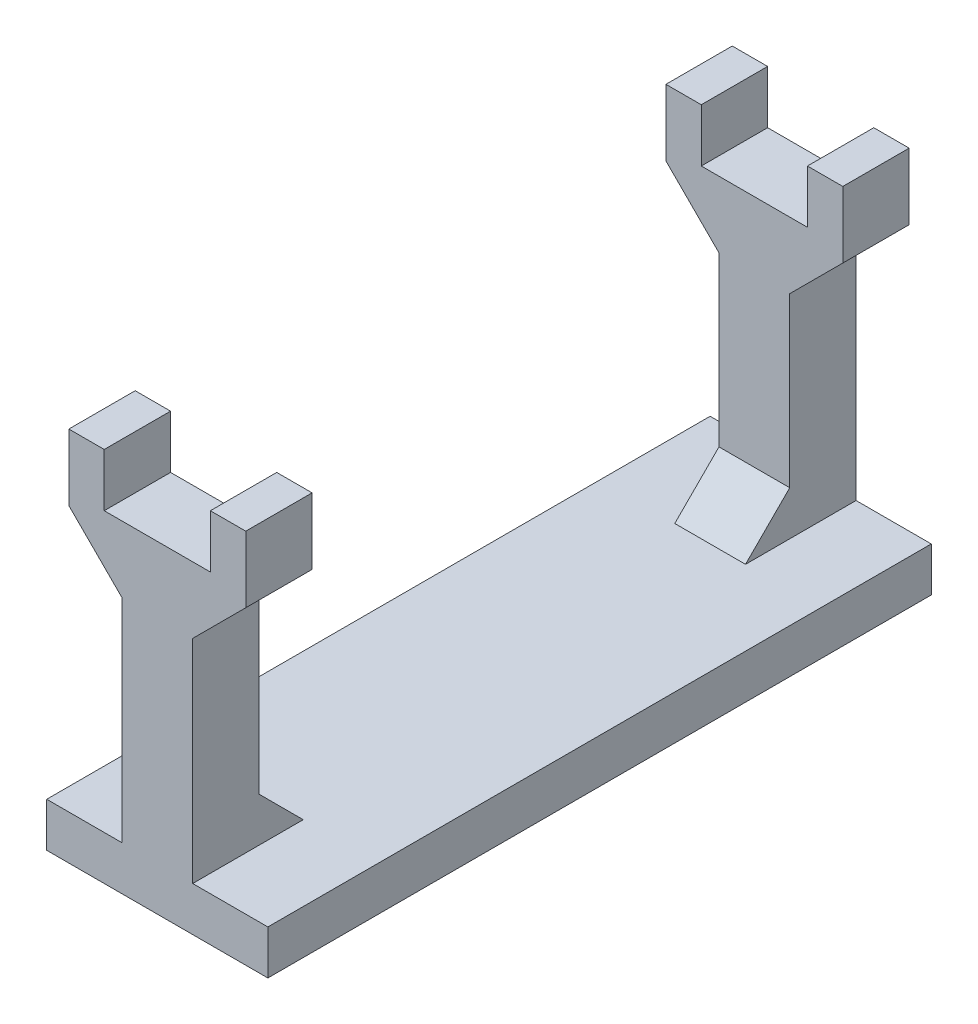
ISO-10303-21;
HEADER;
FILE_DESCRIPTION(('STEP AP214'),'2;1');
FILE_NAME('part.step','',(''),(''),'','','');
FILE_SCHEMA(('AUTOMOTIVE_DESIGN { 1 0 10303 214 1 1 1 1 }'));
ENDSEC;
DATA;
#1=APPLICATION_CONTEXT('core data for automotive mechanical design processes');
#2=APPLICATION_PROTOCOL_DEFINITION('international standard','automotive_design',2000,#1);
#3=PRODUCT_CONTEXT('',#1,'mechanical');
#4=PRODUCT('Part','Part','',(#3));
#5=PRODUCT_RELATED_PRODUCT_CATEGORY('part','',(#4));
#6=PRODUCT_DEFINITION_FORMATION('','',#4);
#7=PRODUCT_DEFINITION_CONTEXT('part definition',#1,'design');
#8=PRODUCT_DEFINITION('design','',#6,#7);
#9=PRODUCT_DEFINITION_SHAPE('','',#8);
#10=(LENGTH_UNIT() NAMED_UNIT(*) SI_UNIT(.MILLI.,.METRE.));
#11=(NAMED_UNIT(*) PLANE_ANGLE_UNIT() SI_UNIT($,.RADIAN.));
#12=(NAMED_UNIT(*) SI_UNIT($,.STERADIAN.) SOLID_ANGLE_UNIT());
#13=UNCERTAINTY_MEASURE_WITH_UNIT(LENGTH_MEASURE(1.E-05),#10,'distance_accuracy_value','');
#14=(GEOMETRIC_REPRESENTATION_CONTEXT(3) GLOBAL_UNCERTAINTY_ASSIGNED_CONTEXT((#13)) GLOBAL_UNIT_ASSIGNED_CONTEXT((#10,
#11,#12)) REPRESENTATION_CONTEXT('',''));
#15=CARTESIAN_POINT('',(0.,0.,0.));
#16=DIRECTION('',(0.,0.,1.));
#17=DIRECTION('',(1.,0.,0.));
#18=AXIS2_PLACEMENT_3D('',#15,#16,#17);
#19=CARTESIAN_POINT('',(33.,58.,150.));
#20=DIRECTION('',(-1.,0.,0.));
#21=DIRECTION('',(0.,-1.,0.));
#22=AXIS2_PLACEMENT_3D('',#19,#20,#21);
#23=PLANE('',#22);
#24=DIRECTION('',(0.,0.,-1.));
#25=VECTOR('',#24,1.);
#26=CARTESIAN_POINT('',(33.,58.,150.));
#27=LINE('',#26,#25);
#28=CARTESIAN_POINT('',(33.,58.,15.));
#29=VERTEX_POINT('',#28);
#30=CARTESIAN_POINT('',(33.,58.,0.));
#31=VERTEX_POINT('',#30);
#32=EDGE_CURVE('E280',#29,#31,#27,.T.);
#33=ORIENTED_EDGE('',*,*,#32,.F.);
#34=DIRECTION('',(0.,-1.,0.));
#35=VECTOR('',#34,1.);
#36=CARTESIAN_POINT('',(33.,58.0000000000001,15.));
#37=LINE('',#36,#35);
#38=CARTESIAN_POINT('',(33.,19.9999999999999,15.));
#39=VERTEX_POINT('',#38);
#40=EDGE_CURVE('E201',#29,#39,#37,.T.);
#41=ORIENTED_EDGE('',*,*,#40,.T.);
#42=DIRECTION('',(0.,-0.707106781186545,0.70710678118655));
#43=VECTOR('',#42,1.);
#44=CARTESIAN_POINT('',(33.,-28.5000000000002,63.5000000000005));
#45=LINE('',#44,#43);
#46=CARTESIAN_POINT('',(33.,10.,25.));
#47=VERTEX_POINT('',#46);
#48=EDGE_CURVE('E305',#39,#47,#45,.T.);
#49=ORIENTED_EDGE('',*,*,#48,.T.);
#50=DIRECTION('',(0.,0.,-1.));
#51=VECTOR('',#50,1.);
#52=CARTESIAN_POINT('',(33.,10.,150.));
#53=LINE('',#52,#51);
#54=CARTESIAN_POINT('',(33.,10.,0.));
#55=VERTEX_POINT('',#54);
#56=EDGE_CURVE('E284',#47,#55,#53,.T.);
#57=ORIENTED_EDGE('',*,*,#56,.T.);
#58=DIRECTION('',(0.,1.,0.));
#59=VECTOR('',#58,1.);
#60=CARTESIAN_POINT('',(33.,58.,0.));
#61=LINE('',#60,#59);
#62=EDGE_CURVE('E207',#55,#31,#61,.T.);
#63=ORIENTED_EDGE('',*,*,#62,.T.);
#64=EDGE_LOOP('',(#33,#41,#49,#57,#63));
#65=FACE_BOUND('',#64,.T.);
#66=ADVANCED_FACE('F37',(#65),#23,.F.);
#67=CARTESIAN_POINT('',(33.,58.,150.));
#68=DIRECTION('',(-0.707106781186546,0.707106781186549,0.));
#69=DIRECTION('',(-0.707106781186549,-0.707106781186546,0.));
#70=AXIS2_PLACEMENT_3D('',#67,#68,#69);
#71=PLANE('',#70);
#72=DIRECTION('',(0.,0.,-1.));
#73=VECTOR('',#72,1.);
#74=CARTESIAN_POINT('',(45.,70.,150.));
#75=LINE('',#74,#73);
#76=CARTESIAN_POINT('',(45.,70.,15.));
#77=VERTEX_POINT('',#76);
#78=CARTESIAN_POINT('',(45.,70.,0.));
#79=VERTEX_POINT('',#78);
#80=EDGE_CURVE('E276',#77,#79,#75,.T.);
#81=ORIENTED_EDGE('',*,*,#80,.F.);
#82=DIRECTION('',(-0.707106781186549,-0.707106781186546,0.));
#83=VECTOR('',#82,1.);
#84=CARTESIAN_POINT('',(33.,58.0000000000001,15.));
#85=LINE('',#84,#83);
#86=EDGE_CURVE('E349',#77,#29,#85,.T.);
#87=ORIENTED_EDGE('',*,*,#86,.T.);
#88=ORIENTED_EDGE('',*,*,#32,.T.);
#89=DIRECTION('',(0.707106781186549,0.707106781186546,0.));
#90=VECTOR('',#89,1.);
#91=CARTESIAN_POINT('',(33.,58.,0.));
#92=LINE('',#91,#90);
#93=EDGE_CURVE('E210',#31,#79,#92,.T.);
#94=ORIENTED_EDGE('',*,*,#93,.T.);
#95=EDGE_LOOP('',(#81,#87,#88,#94));
#96=FACE_BOUND('',#95,.T.);
#97=ADVANCED_FACE('F494',(#96),#71,.F.);
#98=CARTESIAN_POINT('',(45.,85.,150.));
#99=DIRECTION('',(-1.,0.,0.));
#100=DIRECTION('',(0.,-1.,0.));
#101=AXIS2_PLACEMENT_3D('',#98,#99,#100);
#102=PLANE('',#101);
#103=DIRECTION('',(0.,0.,-1.));
#104=VECTOR('',#103,1.);
#105=CARTESIAN_POINT('',(45.,85.,150.));
#106=LINE('',#105,#104);
#107=CARTESIAN_POINT('',(45.,85.,15.));
#108=VERTEX_POINT('',#107);
#109=CARTESIAN_POINT('',(45.,85.,0.));
#110=VERTEX_POINT('',#109);
#111=EDGE_CURVE('E272',#108,#110,#106,.T.);
#112=ORIENTED_EDGE('',*,*,#111,.F.);
#113=DIRECTION('',(0.,-1.,0.));
#114=VECTOR('',#113,1.);
#115=CARTESIAN_POINT('',(45.,85.,15.));
#116=LINE('',#115,#114);
#117=EDGE_CURVE('E346',#108,#77,#116,.T.);
#118=ORIENTED_EDGE('',*,*,#117,.T.);
#119=ORIENTED_EDGE('',*,*,#80,.T.);
#120=DIRECTION('',(0.,1.,0.));
#121=VECTOR('',#120,1.);
#122=CARTESIAN_POINT('',(45.,85.,0.));
#123=LINE('',#122,#121);
#124=EDGE_CURVE('E213',#79,#110,#123,.T.);
#125=ORIENTED_EDGE('',*,*,#124,.T.);
#126=EDGE_LOOP('',(#112,#118,#119,#125));
#127=FACE_BOUND('',#126,.T.);
#128=ADVANCED_FACE('F501',(#127),#102,.F.);
#129=CARTESIAN_POINT('',(37.,85.,150.));
#130=DIRECTION('',(0.,-1.,0.));
#131=DIRECTION('',(0.,0.,-1.));
#132=AXIS2_PLACEMENT_3D('',#129,#130,#131);
#133=PLANE('',#132);
#134=DIRECTION('',(0.,0.,-1.));
#135=VECTOR('',#134,1.);
#136=CARTESIAN_POINT('',(37.,85.,150.));
#137=LINE('',#136,#135);
#138=CARTESIAN_POINT('',(37.,85.,15.));
#139=VERTEX_POINT('',#138);
#140=CARTESIAN_POINT('',(37.,85.,0.));
#141=VERTEX_POINT('',#140);
#142=EDGE_CURVE('E268',#139,#141,#137,.T.);
#143=ORIENTED_EDGE('',*,*,#142,.F.);
#144=DIRECTION('',(1.,0.,0.));
#145=VECTOR('',#144,1.);
#146=CARTESIAN_POINT('',(0.,85.,15.));
#147=LINE('',#146,#145);
#148=EDGE_CURVE('E430',#139,#108,#147,.T.);
#149=ORIENTED_EDGE('',*,*,#148,.T.);
#150=ORIENTED_EDGE('',*,*,#111,.T.);
#151=DIRECTION('',(-1.,0.,0.));
#152=VECTOR('',#151,1.);
#153=CARTESIAN_POINT('',(37.,85.,0.));
#154=LINE('',#153,#152);
#155=EDGE_CURVE('E216',#110,#141,#154,.T.);
#156=ORIENTED_EDGE('',*,*,#155,.T.);
#157=EDGE_LOOP('',(#143,#149,#150,#156));
#158=FACE_BOUND('',#157,.T.);
#159=ADVANCED_FACE('F562',(#158),#133,.F.);
#160=CARTESIAN_POINT('',(37.,73.,150.));
#161=DIRECTION('',(1.,0.,0.));
#162=DIRECTION('',(0.,1.,0.));
#163=AXIS2_PLACEMENT_3D('',#160,#161,#162);
#164=PLANE('',#163);
#165=DIRECTION('',(0.,0.,-1.));
#166=VECTOR('',#165,1.);
#167=CARTESIAN_POINT('',(37.,73.,150.));
#168=LINE('',#167,#166);
#169=CARTESIAN_POINT('',(37.,73.,15.));
#170=VERTEX_POINT('',#169);
#171=CARTESIAN_POINT('',(37.,73.,0.));
#172=VERTEX_POINT('',#171);
#173=EDGE_CURVE('E264',#170,#172,#168,.T.);
#174=ORIENTED_EDGE('',*,*,#173,.F.);
#175=DIRECTION('',(0.,1.,0.));
#176=VECTOR('',#175,1.);
#177=CARTESIAN_POINT('',(37.,73.,15.));
#178=LINE('',#177,#176);
#179=EDGE_CURVE('E343',#170,#139,#178,.T.);
#180=ORIENTED_EDGE('',*,*,#179,.T.);
#181=ORIENTED_EDGE('',*,*,#142,.T.);
#182=DIRECTION('',(0.,-1.,0.));
#183=VECTOR('',#182,1.);
#184=CARTESIAN_POINT('',(37.,73.,0.));
#185=LINE('',#184,#183);
#186=EDGE_CURVE('E219',#141,#172,#185,.T.);
#187=ORIENTED_EDGE('',*,*,#186,.T.);
#188=EDGE_LOOP('',(#174,#180,#181,#187));
#189=FACE_BOUND('',#188,.T.);
#190=ADVANCED_FACE('F561',(#189),#164,.F.);
#191=CARTESIAN_POINT('',(13.,73.,150.));
#192=DIRECTION('',(0.,-1.,0.));
#193=DIRECTION('',(0.,0.,-1.));
#194=AXIS2_PLACEMENT_3D('',#191,#192,#193);
#195=PLANE('',#194);
#196=DIRECTION('',(0.,0.,-1.));
#197=VECTOR('',#196,1.);
#198=CARTESIAN_POINT('',(13.,73.,150.));
#199=LINE('',#198,#197);
#200=CARTESIAN_POINT('',(13.,73.,15.));
#201=VERTEX_POINT('',#200);
#202=CARTESIAN_POINT('',(13.,73.,0.));
#203=VERTEX_POINT('',#202);
#204=EDGE_CURVE('E260',#201,#203,#199,.T.);
#205=ORIENTED_EDGE('',*,*,#204,.F.);
#206=DIRECTION('',(1.,0.,0.));
#207=VECTOR('',#206,1.);
#208=CARTESIAN_POINT('',(13.,73.,15.));
#209=LINE('',#208,#207);
#210=EDGE_CURVE('E340',#201,#170,#209,.T.);
#211=ORIENTED_EDGE('',*,*,#210,.T.);
#212=ORIENTED_EDGE('',*,*,#173,.T.);
#213=DIRECTION('',(-1.,0.,0.));
#214=VECTOR('',#213,1.);
#215=CARTESIAN_POINT('',(13.,73.,0.));
#216=LINE('',#215,#214);
#217=EDGE_CURVE('E222',#172,#203,#216,.T.);
#218=ORIENTED_EDGE('',*,*,#217,.T.);
#219=EDGE_LOOP('',(#205,#211,#212,#218));
#220=FACE_BOUND('',#219,.T.);
#221=ADVANCED_FACE('F564',(#220),#195,.F.);
#222=CARTESIAN_POINT('',(13.,85.,150.));
#223=DIRECTION('',(-1.,0.,0.));
#224=DIRECTION('',(0.,-1.,0.));
#225=AXIS2_PLACEMENT_3D('',#222,#223,#224);
#226=PLANE('',#225);
#227=DIRECTION('',(0.,0.,-1.));
#228=VECTOR('',#227,1.);
#229=CARTESIAN_POINT('',(13.,85.,150.));
#230=LINE('',#229,#228);
#231=CARTESIAN_POINT('',(13.,85.,15.));
#232=VERTEX_POINT('',#231);
#233=CARTESIAN_POINT('',(13.,85.,0.));
#234=VERTEX_POINT('',#233);
#235=EDGE_CURVE('E256',#232,#234,#230,.T.);
#236=ORIENTED_EDGE('',*,*,#235,.F.);
#237=DIRECTION('',(0.,-1.,0.));
#238=VECTOR('',#237,1.);
#239=CARTESIAN_POINT('',(13.,85.,15.));
#240=LINE('',#239,#238);
#241=EDGE_CURVE('E337',#232,#201,#240,.T.);
#242=ORIENTED_EDGE('',*,*,#241,.T.);
#243=ORIENTED_EDGE('',*,*,#204,.T.);
#244=DIRECTION('',(0.,1.,0.));
#245=VECTOR('',#244,1.);
#246=CARTESIAN_POINT('',(13.,85.,0.));
#247=LINE('',#246,#245);
#248=EDGE_CURVE('E225',#203,#234,#247,.T.);
#249=ORIENTED_EDGE('',*,*,#248,.T.);
#250=EDGE_LOOP('',(#236,#242,#243,#249));
#251=FACE_BOUND('',#250,.T.);
#252=ADVANCED_FACE('F453',(#251),#226,.F.);
#253=CARTESIAN_POINT('',(4.99999999999999,85.,150.));
#254=DIRECTION('',(0.,-1.,0.));
#255=DIRECTION('',(0.,0.,-1.));
#256=AXIS2_PLACEMENT_3D('',#253,#254,#255);
#257=PLANE('',#256);
#258=DIRECTION('',(0.,0.,-1.));
#259=VECTOR('',#258,1.);
#260=CARTESIAN_POINT('',(4.99999999999999,85.,150.));
#261=LINE('',#260,#259);
#262=CARTESIAN_POINT('',(4.99999999999999,85.,15.));
#263=VERTEX_POINT('',#262);
#264=CARTESIAN_POINT('',(4.99999999999999,85.,0.));
#265=VERTEX_POINT('',#264);
#266=EDGE_CURVE('E252',#263,#265,#261,.T.);
#267=ORIENTED_EDGE('',*,*,#266,.F.);
#268=EDGE_CURVE('E402',#263,#232,#147,.T.);
#269=ORIENTED_EDGE('',*,*,#268,.T.);
#270=ORIENTED_EDGE('',*,*,#235,.T.);
#271=DIRECTION('',(-1.,0.,0.));
#272=VECTOR('',#271,1.);
#273=CARTESIAN_POINT('',(4.99999999999999,85.,0.));
#274=LINE('',#273,#272);
#275=EDGE_CURVE('E228',#234,#265,#274,.T.);
#276=ORIENTED_EDGE('',*,*,#275,.T.);
#277=EDGE_LOOP('',(#267,#269,#270,#276));
#278=FACE_BOUND('',#277,.T.);
#279=ADVANCED_FACE('F445',(#278),#257,.F.);
#280=CARTESIAN_POINT('',(4.99999999999999,70.,150.));
#281=DIRECTION('',(1.,0.,0.));
#282=DIRECTION('',(0.,1.,0.));
#283=AXIS2_PLACEMENT_3D('',#280,#281,#282);
#284=PLANE('',#283);
#285=DIRECTION('',(0.,0.,-1.));
#286=VECTOR('',#285,1.);
#287=CARTESIAN_POINT('',(4.99999999999999,70.,150.));
#288=LINE('',#287,#286);
#289=CARTESIAN_POINT('',(4.99999999999999,70.,15.));
#290=VERTEX_POINT('',#289);
#291=CARTESIAN_POINT('',(4.99999999999999,70.,0.));
#292=VERTEX_POINT('',#291);
#293=EDGE_CURVE('E248',#290,#292,#288,.T.);
#294=ORIENTED_EDGE('',*,*,#293,.F.);
#295=DIRECTION('',(0.,1.,0.));
#296=VECTOR('',#295,1.);
#297=CARTESIAN_POINT('',(4.99999999999999,70.,15.));
#298=LINE('',#297,#296);
#299=EDGE_CURVE('E334',#290,#263,#298,.T.);
#300=ORIENTED_EDGE('',*,*,#299,.T.);
#301=ORIENTED_EDGE('',*,*,#266,.T.);
#302=DIRECTION('',(0.,-1.,0.));
#303=VECTOR('',#302,1.);
#304=CARTESIAN_POINT('',(4.99999999999999,70.,0.));
#305=LINE('',#304,#303);
#306=EDGE_CURVE('E231',#265,#292,#305,.T.);
#307=ORIENTED_EDGE('',*,*,#306,.T.);
#308=EDGE_LOOP('',(#294,#300,#301,#307));
#309=FACE_BOUND('',#308,.T.);
#310=ADVANCED_FACE('F467',(#309),#284,.F.);
#311=CARTESIAN_POINT('',(17.,58.,150.));
#312=DIRECTION('',(0.707106781186546,0.707106781186549,0.));
#313=DIRECTION('',(-0.707106781186549,0.707106781186546,0.));
#314=AXIS2_PLACEMENT_3D('',#311,#312,#313);
#315=PLANE('',#314);
#316=DIRECTION('',(0.,0.,-1.));
#317=VECTOR('',#316,1.);
#318=CARTESIAN_POINT('',(17.,58.,150.));
#319=LINE('',#318,#317);
#320=CARTESIAN_POINT('',(17.,58.,15.));
#321=VERTEX_POINT('',#320);
#322=CARTESIAN_POINT('',(17.,58.,0.));
#323=VERTEX_POINT('',#322);
#324=EDGE_CURVE('E186',#321,#323,#319,.T.);
#325=ORIENTED_EDGE('',*,*,#324,.F.);
#326=DIRECTION('',(-0.707106781186549,0.707106781186546,0.));
#327=VECTOR('',#326,1.);
#328=CARTESIAN_POINT('',(17.,58.0000000000001,15.));
#329=LINE('',#328,#327);
#330=EDGE_CURVE('E331',#321,#290,#329,.T.);
#331=ORIENTED_EDGE('',*,*,#330,.T.);
#332=ORIENTED_EDGE('',*,*,#293,.T.);
#333=DIRECTION('',(0.707106781186549,-0.707106781186546,0.));
#334=VECTOR('',#333,1.);
#335=CARTESIAN_POINT('',(17.,58.,0.));
#336=LINE('',#335,#334);
#337=EDGE_CURVE('E234',#292,#323,#336,.T.);
#338=ORIENTED_EDGE('',*,*,#337,.T.);
#339=EDGE_LOOP('',(#325,#331,#332,#338));
#340=FACE_BOUND('',#339,.T.);
#341=ADVANCED_FACE('F476',(#340),#315,.F.);
#342=CARTESIAN_POINT('',(17.,10.,150.));
#343=DIRECTION('',(1.,0.,0.));
#344=DIRECTION('',(0.,1.,0.));
#345=AXIS2_PLACEMENT_3D('',#342,#343,#344);
#346=PLANE('',#345);
#347=DIRECTION('',(0.,0.707106781186545,-0.70710678118655));
#348=VECTOR('',#347,1.);
#349=CARTESIAN_POINT('',(17.,-52.5,87.5000000000005));
#350=LINE('',#349,#348);
#351=CARTESIAN_POINT('',(17.,10.,25.));
#352=VERTEX_POINT('',#351);
#353=CARTESIAN_POINT('',(17.,19.9999999999999,15.));
#354=VERTEX_POINT('',#353);
#355=EDGE_CURVE('E310',#352,#354,#350,.T.);
#356=ORIENTED_EDGE('',*,*,#355,.T.);
#357=DIRECTION('',(0.,1.,0.));
#358=VECTOR('',#357,1.);
#359=CARTESIAN_POINT('',(17.,10.,15.));
#360=LINE('',#359,#358);
#361=EDGE_CURVE('E11',#354,#321,#360,.T.);
#362=ORIENTED_EDGE('',*,*,#361,.T.);
#363=ORIENTED_EDGE('',*,*,#324,.T.);
#364=DIRECTION('',(0.,-1.,0.));
#365=VECTOR('',#364,1.);
#366=CARTESIAN_POINT('',(17.,10.,0.));
#367=LINE('',#366,#365);
#368=CARTESIAN_POINT('',(17.,10.,0.));
#369=VERTEX_POINT('',#368);
#370=EDGE_CURVE('E237',#323,#369,#367,.T.);
#371=ORIENTED_EDGE('',*,*,#370,.T.);
#372=DIRECTION('',(0.,0.,-1.));
#373=VECTOR('',#372,1.);
#374=CARTESIAN_POINT('',(17.,10.,150.));
#375=LINE('',#374,#373);
#376=EDGE_CURVE('E187',#352,#369,#375,.T.);
#377=ORIENTED_EDGE('',*,*,#376,.F.);
#378=EDGE_LOOP('',(#356,#362,#363,#371,#377));
#379=FACE_BOUND('',#378,.T.);
#380=ADVANCED_FACE('F409',(#379),#346,.F.);
#381=CARTESIAN_POINT('',(50.,0.,150.));
#382=DIRECTION('',(0.,1.,0.));
#383=DIRECTION('',(0.,0.,1.));
#384=AXIS2_PLACEMENT_3D('',#381,#382,#383);
#385=PLANE('',#384);
#386=DIRECTION('',(1.,0.,0.));
#387=VECTOR('',#386,1.);
#388=CARTESIAN_POINT('',(50.,0.,0.));
#389=LINE('',#388,#387);
#390=CARTESIAN_POINT('',(0.,0.,0.));
#391=VERTEX_POINT('',#390);
#392=CARTESIAN_POINT('',(50.,0.,0.));
#393=VERTEX_POINT('',#392);
#394=EDGE_CURVE('E197',#391,#393,#389,.T.);
#395=ORIENTED_EDGE('',*,*,#394,.T.);
#396=DIRECTION('',(0.,0.,-1.));
#397=VECTOR('',#396,1.);
#398=CARTESIAN_POINT('',(50.,0.,150.));
#399=LINE('',#398,#397);
#400=CARTESIAN_POINT('',(50.,0.,150.));
#401=VERTEX_POINT('',#400);
#402=EDGE_CURVE('E290',#401,#393,#399,.T.);
#403=ORIENTED_EDGE('',*,*,#402,.F.);
#404=DIRECTION('',(1.,0.,0.));
#405=VECTOR('',#404,1.);
#406=CARTESIAN_POINT('',(50.,0.,150.));
#407=LINE('',#406,#405);
#408=CARTESIAN_POINT('',(0.,0.,150.));
#409=VERTEX_POINT('',#408);
#410=EDGE_CURVE('E243',#409,#401,#407,.T.);
#411=ORIENTED_EDGE('',*,*,#410,.F.);
#412=DIRECTION('',(0.,0.,-1.));
#413=VECTOR('',#412,1.);
#414=CARTESIAN_POINT('',(0.,0.,150.));
#415=LINE('',#414,#413);
#416=EDGE_CURVE('E193',#409,#391,#415,.T.);
#417=ORIENTED_EDGE('',*,*,#416,.T.);
#418=EDGE_LOOP('',(#395,#403,#411,#417));
#419=FACE_BOUND('',#418,.T.);
#420=ADVANCED_FACE('F39',(#419),#385,.F.);
#421=CARTESIAN_POINT('',(50.,10.,150.));
#422=DIRECTION('',(-1.,0.,0.));
#423=DIRECTION('',(0.,0.,1.));
#424=AXIS2_PLACEMENT_3D('',#421,#422,#423);
#425=PLANE('',#424);
#426=DIRECTION('',(0.,1.,0.));
#427=VECTOR('',#426,1.);
#428=CARTESIAN_POINT('',(50.,10.,0.));
#429=LINE('',#428,#427);
#430=CARTESIAN_POINT('',(50.,10.,0.));
#431=VERTEX_POINT('',#430);
#432=EDGE_CURVE('E200',#393,#431,#429,.T.);
#433=ORIENTED_EDGE('',*,*,#432,.T.);
#434=DIRECTION('',(0.,0.,-1.));
#435=VECTOR('',#434,1.);
#436=CARTESIAN_POINT('',(50.,10.,150.));
#437=LINE('',#436,#435);
#438=CARTESIAN_POINT('',(50.,10.,150.));
#439=VERTEX_POINT('',#438);
#440=EDGE_CURVE('E288',#439,#431,#437,.T.);
#441=ORIENTED_EDGE('',*,*,#440,.F.);
#442=DIRECTION('',(0.,1.,0.));
#443=VECTOR('',#442,1.);
#444=CARTESIAN_POINT('',(50.,10.,150.));
#445=LINE('',#444,#443);
#446=EDGE_CURVE('E126',#401,#439,#445,.T.);
#447=ORIENTED_EDGE('',*,*,#446,.F.);
#448=ORIENTED_EDGE('',*,*,#402,.T.);
#449=EDGE_LOOP('',(#433,#441,#447,#448));
#450=FACE_BOUND('',#449,.T.);
#451=ADVANCED_FACE('F507',(#450),#425,.F.);
#452=CARTESIAN_POINT('',(33.,10.,150.));
#453=VERTEX_POINT('',#452);
#454=CARTESIAN_POINT('',(33.,10.,125.));
#455=VERTEX_POINT('',#454);
#456=EDGE_CURVE('E285',#453,#455,#53,.T.);
#457=ORIENTED_EDGE('',*,*,#456,.T.);
#458=DIRECTION('',(0.,0.707106781186544,0.707106781186551));
#459=VECTOR('',#458,1.);
#460=CARTESIAN_POINT('',(33.,46.4999999999998,161.5));
#461=LINE('',#460,#459);
#462=CARTESIAN_POINT('',(33.,19.9999999999999,135.));
#463=VERTEX_POINT('',#462);
#464=EDGE_CURVE('E401',#455,#463,#461,.T.);
#465=ORIENTED_EDGE('',*,*,#464,.T.);
#466=DIRECTION('',(0.,1.,0.));
#467=VECTOR('',#466,1.);
#468=CARTESIAN_POINT('',(33.,58.,135.));
#469=LINE('',#468,#467);
#470=CARTESIAN_POINT('',(33.,58.,135.));
#471=VERTEX_POINT('',#470);
#472=EDGE_CURVE('E328',#463,#471,#469,.T.);
#473=ORIENTED_EDGE('',*,*,#472,.T.);
#474=CARTESIAN_POINT('',(33.,58.,150.));
#475=VERTEX_POINT('',#474);
#476=EDGE_CURVE('E281',#475,#471,#27,.T.);
#477=ORIENTED_EDGE('',*,*,#476,.F.);
#478=DIRECTION('',(0.,1.,0.));
#479=VECTOR('',#478,1.);
#480=CARTESIAN_POINT('',(33.,58.,150.));
#481=LINE('',#480,#479);
#482=EDGE_CURVE('E358',#453,#475,#481,.T.);
#483=ORIENTED_EDGE('',*,*,#482,.F.);
#484=EDGE_LOOP('',(#457,#465,#473,#477,#483));
#485=FACE_BOUND('',#484,.T.);
#486=ADVANCED_FACE('F497',(#485),#23,.F.);
#487=ORIENTED_EDGE('',*,*,#476,.T.);
#488=DIRECTION('',(0.707106781186549,0.707106781186546,0.));
#489=VECTOR('',#488,1.);
#490=CARTESIAN_POINT('',(33.,58.,135.));
#491=LINE('',#490,#489);
#492=CARTESIAN_POINT('',(45.,70.,135.));
#493=VERTEX_POINT('',#492);
#494=EDGE_CURVE('E325',#471,#493,#491,.T.);
#495=ORIENTED_EDGE('',*,*,#494,.T.);
#496=CARTESIAN_POINT('',(45.,70.,150.));
#497=VERTEX_POINT('',#496);
#498=EDGE_CURVE('E277',#497,#493,#75,.T.);
#499=ORIENTED_EDGE('',*,*,#498,.F.);
#500=DIRECTION('',(0.707106781186549,0.707106781186546,0.));
#501=VECTOR('',#500,1.);
#502=CARTESIAN_POINT('',(33.,58.,150.));
#503=LINE('',#502,#501);
#504=EDGE_CURVE('E360',#475,#497,#503,.T.);
#505=ORIENTED_EDGE('',*,*,#504,.F.);
#506=EDGE_LOOP('',(#487,#495,#499,#505));
#507=FACE_BOUND('',#506,.T.);
#508=ADVANCED_FACE('F504',(#507),#71,.F.);
#509=ORIENTED_EDGE('',*,*,#498,.T.);
#510=DIRECTION('',(0.,1.,0.));
#511=VECTOR('',#510,1.);
#512=CARTESIAN_POINT('',(45.,85.,135.));
#513=LINE('',#512,#511);
#514=CARTESIAN_POINT('',(45.,85.,135.));
#515=VERTEX_POINT('',#514);
#516=EDGE_CURVE('E322',#493,#515,#513,.T.);
#517=ORIENTED_EDGE('',*,*,#516,.T.);
#518=CARTESIAN_POINT('',(45.,85.,150.));
#519=VERTEX_POINT('',#518);
#520=EDGE_CURVE('E273',#519,#515,#106,.T.);
#521=ORIENTED_EDGE('',*,*,#520,.F.);
#522=DIRECTION('',(0.,1.,0.));
#523=VECTOR('',#522,1.);
#524=CARTESIAN_POINT('',(45.,85.,150.));
#525=LINE('',#524,#523);
#526=EDGE_CURVE('E362',#497,#519,#525,.T.);
#527=ORIENTED_EDGE('',*,*,#526,.F.);
#528=EDGE_LOOP('',(#509,#517,#521,#527));
#529=FACE_BOUND('',#528,.T.);
#530=ADVANCED_FACE('F513',(#529),#102,.F.);
#531=ORIENTED_EDGE('',*,*,#520,.T.);
#532=DIRECTION('',(1.,0.,0.));
#533=VECTOR('',#532,1.);
#534=CARTESIAN_POINT('',(0.,85.,135.));
#535=LINE('',#534,#533);
#536=CARTESIAN_POINT('',(37.,85.,135.));
#537=VERTEX_POINT('',#536);
#538=EDGE_CURVE('E393',#537,#515,#535,.T.);
#539=ORIENTED_EDGE('',*,*,#538,.F.);
#540=CARTESIAN_POINT('',(37.,85.,150.));
#541=VERTEX_POINT('',#540);
#542=EDGE_CURVE('E269',#541,#537,#137,.T.);
#543=ORIENTED_EDGE('',*,*,#542,.F.);
#544=DIRECTION('',(-1.,0.,0.));
#545=VECTOR('',#544,1.);
#546=CARTESIAN_POINT('',(37.,85.,150.));
#547=LINE('',#546,#545);
#548=EDGE_CURVE('E364',#519,#541,#547,.T.);
#549=ORIENTED_EDGE('',*,*,#548,.F.);
#550=EDGE_LOOP('',(#531,#539,#543,#549));
#551=FACE_BOUND('',#550,.T.);
#552=ADVANCED_FACE('F583',(#551),#133,.F.);
#553=ORIENTED_EDGE('',*,*,#542,.T.);
#554=DIRECTION('',(0.,-1.,0.));
#555=VECTOR('',#554,1.);
#556=CARTESIAN_POINT('',(37.,73.,135.));
#557=LINE('',#556,#555);
#558=CARTESIAN_POINT('',(37.,73.,135.));
#559=VERTEX_POINT('',#558);
#560=EDGE_CURVE('E319',#537,#559,#557,.T.);
#561=ORIENTED_EDGE('',*,*,#560,.T.);
#562=CARTESIAN_POINT('',(37.,73.,150.));
#563=VERTEX_POINT('',#562);
#564=EDGE_CURVE('E265',#563,#559,#168,.T.);
#565=ORIENTED_EDGE('',*,*,#564,.F.);
#566=DIRECTION('',(0.,-1.,0.));
#567=VECTOR('',#566,1.);
#568=CARTESIAN_POINT('',(37.,73.,150.));
#569=LINE('',#568,#567);
#570=EDGE_CURVE('E366',#541,#563,#569,.T.);
#571=ORIENTED_EDGE('',*,*,#570,.F.);
#572=EDGE_LOOP('',(#553,#561,#565,#571));
#573=FACE_BOUND('',#572,.T.);
#574=ADVANCED_FACE('F575',(#573),#164,.F.);
#575=ORIENTED_EDGE('',*,*,#564,.T.);
#576=DIRECTION('',(-1.,0.,0.));
#577=VECTOR('',#576,1.);
#578=CARTESIAN_POINT('',(13.,73.,135.));
#579=LINE('',#578,#577);
#580=CARTESIAN_POINT('',(13.,73.,135.));
#581=VERTEX_POINT('',#580);
#582=EDGE_CURVE('E316',#559,#581,#579,.T.);
#583=ORIENTED_EDGE('',*,*,#582,.T.);
#584=CARTESIAN_POINT('',(13.,73.,150.));
#585=VERTEX_POINT('',#584);
#586=EDGE_CURVE('E261',#585,#581,#199,.T.);
#587=ORIENTED_EDGE('',*,*,#586,.F.);
#588=DIRECTION('',(-1.,0.,0.));
#589=VECTOR('',#588,1.);
#590=CARTESIAN_POINT('',(13.,73.,150.));
#591=LINE('',#590,#589);
#592=EDGE_CURVE('E368',#563,#585,#591,.T.);
#593=ORIENTED_EDGE('',*,*,#592,.F.);
#594=EDGE_LOOP('',(#575,#583,#587,#593));
#595=FACE_BOUND('',#594,.T.);
#596=ADVANCED_FACE('F567',(#595),#195,.F.);
#597=ORIENTED_EDGE('',*,*,#586,.T.);
#598=DIRECTION('',(0.,1.,0.));
#599=VECTOR('',#598,1.);
#600=CARTESIAN_POINT('',(13.,85.,135.));
#601=LINE('',#600,#599);
#602=CARTESIAN_POINT('',(13.,85.,135.));
#603=VERTEX_POINT('',#602);
#604=EDGE_CURVE('E307',#581,#603,#601,.T.);
#605=ORIENTED_EDGE('',*,*,#604,.T.);
#606=CARTESIAN_POINT('',(13.,85.,150.));
#607=VERTEX_POINT('',#606);
#608=EDGE_CURVE('E257',#607,#603,#230,.T.);
#609=ORIENTED_EDGE('',*,*,#608,.F.);
#610=DIRECTION('',(0.,1.,0.));
#611=VECTOR('',#610,1.);
#612=CARTESIAN_POINT('',(13.,85.,150.));
#613=LINE('',#612,#611);
#614=EDGE_CURVE('E370',#585,#607,#613,.T.);
#615=ORIENTED_EDGE('',*,*,#614,.F.);
#616=EDGE_LOOP('',(#597,#605,#609,#615));
#617=FACE_BOUND('',#616,.T.);
#618=ADVANCED_FACE('F573',(#617),#226,.F.);
#619=ORIENTED_EDGE('',*,*,#608,.T.);
#620=CARTESIAN_POINT('',(4.99999999999999,85.,135.));
#621=VERTEX_POINT('',#620);
#622=EDGE_CURVE('E387',#621,#603,#535,.T.);
#623=ORIENTED_EDGE('',*,*,#622,.F.);
#624=CARTESIAN_POINT('',(4.99999999999999,85.,150.));
#625=VERTEX_POINT('',#624);
#626=EDGE_CURVE('E253',#625,#621,#261,.T.);
#627=ORIENTED_EDGE('',*,*,#626,.F.);
#628=DIRECTION('',(-1.,0.,0.));
#629=VECTOR('',#628,1.);
#630=CARTESIAN_POINT('',(4.99999999999999,85.,150.));
#631=LINE('',#630,#629);
#632=EDGE_CURVE('E372',#607,#625,#631,.T.);
#633=ORIENTED_EDGE('',*,*,#632,.F.);
#634=EDGE_LOOP('',(#619,#623,#627,#633));
#635=FACE_BOUND('',#634,.T.);
#636=ADVANCED_FACE('F391',(#635),#257,.F.);
#637=ORIENTED_EDGE('',*,*,#626,.T.);
#638=DIRECTION('',(0.,-1.,0.));
#639=VECTOR('',#638,1.);
#640=CARTESIAN_POINT('',(4.99999999999999,70.,135.));
#641=LINE('',#640,#639);
#642=CARTESIAN_POINT('',(4.99999999999999,70.,135.));
#643=VERTEX_POINT('',#642);
#644=EDGE_CURVE('E304',#621,#643,#641,.T.);
#645=ORIENTED_EDGE('',*,*,#644,.T.);
#646=CARTESIAN_POINT('',(4.99999999999999,70.,150.));
#647=VERTEX_POINT('',#646);
#648=EDGE_CURVE('E249',#647,#643,#288,.T.);
#649=ORIENTED_EDGE('',*,*,#648,.F.);
#650=DIRECTION('',(0.,-1.,0.));
#651=VECTOR('',#650,1.);
#652=CARTESIAN_POINT('',(4.99999999999999,70.,150.));
#653=LINE('',#652,#651);
#654=EDGE_CURVE('E374',#625,#647,#653,.T.);
#655=ORIENTED_EDGE('',*,*,#654,.F.);
#656=EDGE_LOOP('',(#637,#645,#649,#655));
#657=FACE_BOUND('',#656,.T.);
#658=ADVANCED_FACE('F379',(#657),#284,.F.);
#659=ORIENTED_EDGE('',*,*,#648,.T.);
#660=DIRECTION('',(0.707106781186549,-0.707106781186546,0.));
#661=VECTOR('',#660,1.);
#662=CARTESIAN_POINT('',(17.,58.,135.));
#663=LINE('',#662,#661);
#664=CARTESIAN_POINT('',(17.,58.,135.));
#665=VERTEX_POINT('',#664);
#666=EDGE_CURVE('E297',#643,#665,#663,.T.);
#667=ORIENTED_EDGE('',*,*,#666,.T.);
#668=CARTESIAN_POINT('',(17.,58.,150.));
#669=VERTEX_POINT('',#668);
#670=EDGE_CURVE('E246',#669,#665,#319,.T.);
#671=ORIENTED_EDGE('',*,*,#670,.F.);
#672=DIRECTION('',(0.707106781186549,-0.707106781186546,0.));
#673=VECTOR('',#672,1.);
#674=CARTESIAN_POINT('',(17.,58.,150.));
#675=LINE('',#674,#673);
#676=EDGE_CURVE('E172',#647,#669,#675,.T.);
#677=ORIENTED_EDGE('',*,*,#676,.F.);
#678=EDGE_LOOP('',(#659,#667,#671,#677));
#679=FACE_BOUND('',#678,.T.);
#680=ADVANCED_FACE('F302',(#679),#315,.F.);
#681=DIRECTION('',(0.,-1.,0.));
#682=VECTOR('',#681,1.);
#683=CARTESIAN_POINT('',(17.,10.,135.));
#684=LINE('',#683,#682);
#685=CARTESIAN_POINT('',(17.,19.9999999999999,135.));
#686=VERTEX_POINT('',#685);
#687=EDGE_CURVE('E45',#665,#686,#684,.T.);
#688=ORIENTED_EDGE('',*,*,#687,.T.);
#689=DIRECTION('',(0.,-0.707106781186544,-0.707106781186551));
#690=VECTOR('',#689,1.);
#691=CARTESIAN_POINT('',(17.,22.5,137.5));
#692=LINE('',#691,#690);
#693=CARTESIAN_POINT('',(17.,10.,125.));
#694=VERTEX_POINT('',#693);
#695=EDGE_CURVE('E183',#686,#694,#692,.T.);
#696=ORIENTED_EDGE('',*,*,#695,.T.);
#697=CARTESIAN_POINT('',(17.,10.,150.));
#698=VERTEX_POINT('',#697);
#699=EDGE_CURVE('E179',#698,#694,#375,.T.);
#700=ORIENTED_EDGE('',*,*,#699,.F.);
#701=DIRECTION('',(0.,-1.,0.));
#702=VECTOR('',#701,1.);
#703=CARTESIAN_POINT('',(17.,10.,150.));
#704=LINE('',#703,#702);
#705=EDGE_CURVE('E165',#669,#698,#704,.T.);
#706=ORIENTED_EDGE('',*,*,#705,.F.);
#707=ORIENTED_EDGE('',*,*,#670,.T.);
#708=EDGE_LOOP('',(#688,#696,#700,#706,#707));
#709=FACE_BOUND('',#708,.T.);
#710=ADVANCED_FACE('F181',(#709),#346,.F.);
#711=CARTESIAN_POINT('',(0.,10.,150.));
#712=DIRECTION('',(0.,-1.,0.));
#713=DIRECTION('',(0.,0.,-1.));
#714=AXIS2_PLACEMENT_3D('',#711,#712,#713);
#715=PLANE('',#714);
#716=ORIENTED_EDGE('',*,*,#699,.T.);
#717=DIRECTION('',(1.,0.,0.));
#718=VECTOR('',#717,1.);
#719=CARTESIAN_POINT('',(0.,10.,125.));
#720=LINE('',#719,#718);
#721=EDGE_CURVE('E395',#694,#455,#720,.T.);
#722=ORIENTED_EDGE('',*,*,#721,.T.);
#723=ORIENTED_EDGE('',*,*,#456,.F.);
#724=DIRECTION('',(-1.,0.,0.));
#725=VECTOR('',#724,1.);
#726=CARTESIAN_POINT('',(33.,10.,150.));
#727=LINE('',#726,#725);
#728=EDGE_CURVE('E356',#439,#453,#727,.T.);
#729=ORIENTED_EDGE('',*,*,#728,.F.);
#730=ORIENTED_EDGE('',*,*,#440,.T.);
#731=DIRECTION('',(-1.,0.,0.));
#732=VECTOR('',#731,1.);
#733=CARTESIAN_POINT('',(33.,10.,0.));
#734=LINE('',#733,#732);
#735=EDGE_CURVE('E204',#431,#55,#734,.T.);
#736=ORIENTED_EDGE('',*,*,#735,.T.);
#737=ORIENTED_EDGE('',*,*,#56,.F.);
#738=DIRECTION('',(1.,0.,0.));
#739=VECTOR('',#738,1.);
#740=CARTESIAN_POINT('',(0.,10.,25.));
#741=LINE('',#740,#739);
#742=EDGE_CURVE('E423',#352,#47,#741,.T.);
#743=ORIENTED_EDGE('',*,*,#742,.F.);
#744=ORIENTED_EDGE('',*,*,#376,.T.);
#745=DIRECTION('',(-1.,0.,0.));
#746=VECTOR('',#745,1.);
#747=CARTESIAN_POINT('',(0.,10.,0.));
#748=LINE('',#747,#746);
#749=CARTESIAN_POINT('',(0.,10.,0.));
#750=VERTEX_POINT('',#749);
#751=EDGE_CURVE('E240',#369,#750,#748,.T.);
#752=ORIENTED_EDGE('',*,*,#751,.T.);
#753=DIRECTION('',(0.,0.,-1.));
#754=VECTOR('',#753,1.);
#755=CARTESIAN_POINT('',(0.,10.,150.));
#756=LINE('',#755,#754);
#757=CARTESIAN_POINT('',(0.,10.,150.));
#758=VERTEX_POINT('',#757);
#759=EDGE_CURVE('E191',#758,#750,#756,.T.);
#760=ORIENTED_EDGE('',*,*,#759,.F.);
#761=DIRECTION('',(-1.,0.,0.));
#762=VECTOR('',#761,1.);
#763=CARTESIAN_POINT('',(0.,10.,150.));
#764=LINE('',#763,#762);
#765=EDGE_CURVE('E169',#698,#758,#764,.T.);
#766=ORIENTED_EDGE('',*,*,#765,.F.);
#767=EDGE_LOOP('',(#716,#722,#723,#729,#730,#736,#737,#743,#744,#752,#760,#766));
#768=FACE_BOUND('',#767,.T.);
#769=ADVANCED_FACE('F189',(#768),#715,.F.);
#770=CARTESIAN_POINT('',(0.,0.,150.));
#771=DIRECTION('',(1.,0.,0.));
#772=DIRECTION('',(0.,0.,-1.));
#773=AXIS2_PLACEMENT_3D('',#770,#771,#772);
#774=PLANE('',#773);
#775=DIRECTION('',(0.,-1.,0.));
#776=VECTOR('',#775,1.);
#777=CARTESIAN_POINT('',(0.,0.,0.));
#778=LINE('',#777,#776);
#779=EDGE_CURVE('E117',#750,#391,#778,.T.);
#780=ORIENTED_EDGE('',*,*,#779,.T.);
#781=ORIENTED_EDGE('',*,*,#416,.F.);
#782=DIRECTION('',(0.,-1.,0.));
#783=VECTOR('',#782,1.);
#784=CARTESIAN_POINT('',(0.,0.,150.));
#785=LINE('',#784,#783);
#786=EDGE_CURVE('E61',#758,#409,#785,.T.);
#787=ORIENTED_EDGE('',*,*,#786,.F.);
#788=ORIENTED_EDGE('',*,*,#759,.T.);
#789=EDGE_LOOP('',(#780,#781,#787,#788));
#790=FACE_BOUND('',#789,.T.);
#791=ADVANCED_FACE('F483',(#790),#774,.F.);
#792=CARTESIAN_POINT('',(0.,0.,150.));
#793=DIRECTION('',(0.,0.,-1.));
#794=DIRECTION('',(-1.,0.,0.));
#795=AXIS2_PLACEMENT_3D('',#792,#793,#794);
#796=PLANE('',#795);
#797=ORIENTED_EDGE('',*,*,#410,.T.);
#798=ORIENTED_EDGE('',*,*,#446,.T.);
#799=ORIENTED_EDGE('',*,*,#728,.T.);
#800=ORIENTED_EDGE('',*,*,#482,.T.);
#801=ORIENTED_EDGE('',*,*,#504,.T.);
#802=ORIENTED_EDGE('',*,*,#526,.T.);
#803=ORIENTED_EDGE('',*,*,#548,.T.);
#804=ORIENTED_EDGE('',*,*,#570,.T.);
#805=ORIENTED_EDGE('',*,*,#592,.T.);
#806=ORIENTED_EDGE('',*,*,#614,.T.);
#807=ORIENTED_EDGE('',*,*,#632,.T.);
#808=ORIENTED_EDGE('',*,*,#654,.T.);
#809=ORIENTED_EDGE('',*,*,#676,.T.);
#810=ORIENTED_EDGE('',*,*,#705,.T.);
#811=ORIENTED_EDGE('',*,*,#765,.T.);
#812=ORIENTED_EDGE('',*,*,#786,.T.);
#813=EDGE_LOOP('',(#797,#798,#799,#800,#801,#802,#803,#804,#805,#806,#807,#808,#809,#810,#811,#812));
#814=FACE_BOUND('',#813,.T.);
#815=ADVANCED_FACE('F167',(#814),#796,.F.);
#816=CARTESIAN_POINT('',(0.,0.,0.));
#817=DIRECTION('',(0.,0.,-1.));
#818=DIRECTION('',(-1.,0.,0.));
#819=AXIS2_PLACEMENT_3D('',#816,#817,#818);
#820=PLANE('',#819);
#821=ORIENTED_EDGE('',*,*,#394,.F.);
#822=ORIENTED_EDGE('',*,*,#779,.F.);
#823=ORIENTED_EDGE('',*,*,#751,.F.);
#824=ORIENTED_EDGE('',*,*,#370,.F.);
#825=ORIENTED_EDGE('',*,*,#337,.F.);
#826=ORIENTED_EDGE('',*,*,#306,.F.);
#827=ORIENTED_EDGE('',*,*,#275,.F.);
#828=ORIENTED_EDGE('',*,*,#248,.F.);
#829=ORIENTED_EDGE('',*,*,#217,.F.);
#830=ORIENTED_EDGE('',*,*,#186,.F.);
#831=ORIENTED_EDGE('',*,*,#155,.F.);
#832=ORIENTED_EDGE('',*,*,#124,.F.);
#833=ORIENTED_EDGE('',*,*,#93,.F.);
#834=ORIENTED_EDGE('',*,*,#62,.F.);
#835=ORIENTED_EDGE('',*,*,#735,.F.);
#836=ORIENTED_EDGE('',*,*,#432,.F.);
#837=EDGE_LOOP('',(#821,#822,#823,#824,#825,#826,#827,#828,#829,#830,#831,#832,#833,#834,#835,#836));
#838=FACE_BOUND('',#837,.T.);
#839=ADVANCED_FACE('F462',(#838),#820,.T.);
#840=CARTESIAN_POINT('',(0.,19.9999999999999,15.));
#841=DIRECTION('',(0.,0.,-1.));
#842=DIRECTION('',(0.,1.,0.));
#843=AXIS2_PLACEMENT_3D('',#840,#841,#842);
#844=PLANE('',#843);
#845=ORIENTED_EDGE('',*,*,#86,.F.);
#846=ORIENTED_EDGE('',*,*,#117,.F.);
#847=ORIENTED_EDGE('',*,*,#148,.F.);
#848=ORIENTED_EDGE('',*,*,#179,.F.);
#849=ORIENTED_EDGE('',*,*,#210,.F.);
#850=ORIENTED_EDGE('',*,*,#241,.F.);
#851=ORIENTED_EDGE('',*,*,#268,.F.);
#852=ORIENTED_EDGE('',*,*,#299,.F.);
#853=ORIENTED_EDGE('',*,*,#330,.F.);
#854=ORIENTED_EDGE('',*,*,#361,.F.);
#855=DIRECTION('',(1.,0.,0.));
#856=VECTOR('',#855,1.);
#857=CARTESIAN_POINT('',(0.,19.9999999999999,15.));
#858=LINE('',#857,#856);
#859=EDGE_CURVE('E425',#354,#39,#858,.T.);
#860=ORIENTED_EDGE('',*,*,#859,.T.);
#861=ORIENTED_EDGE('',*,*,#40,.F.);
#862=EDGE_LOOP('',(#845,#846,#847,#848,#849,#850,#851,#852,#853,#854,#860,#861));
#863=FACE_BOUND('',#862,.T.);
#864=ADVANCED_FACE('F473',(#863),#844,.F.);
#865=CARTESIAN_POINT('',(0.,85.,135.));
#866=DIRECTION('',(0.,0.,1.));
#867=DIRECTION('',(1.,0.,0.));
#868=AXIS2_PLACEMENT_3D('',#865,#866,#867);
#869=PLANE('',#868);
#870=DIRECTION('',(1.,0.,0.));
#871=VECTOR('',#870,1.);
#872=CARTESIAN_POINT('',(0.,19.9999999999999,135.));
#873=LINE('',#872,#871);
#874=EDGE_CURVE('E52',#686,#463,#873,.T.);
#875=ORIENTED_EDGE('',*,*,#874,.F.);
#876=ORIENTED_EDGE('',*,*,#687,.F.);
#877=ORIENTED_EDGE('',*,*,#666,.F.);
#878=ORIENTED_EDGE('',*,*,#644,.F.);
#879=ORIENTED_EDGE('',*,*,#622,.T.);
#880=ORIENTED_EDGE('',*,*,#604,.F.);
#881=ORIENTED_EDGE('',*,*,#582,.F.);
#882=ORIENTED_EDGE('',*,*,#560,.F.);
#883=ORIENTED_EDGE('',*,*,#538,.T.);
#884=ORIENTED_EDGE('',*,*,#516,.F.);
#885=ORIENTED_EDGE('',*,*,#494,.F.);
#886=ORIENTED_EDGE('',*,*,#472,.F.);
#887=EDGE_LOOP('',(#875,#876,#877,#878,#879,#880,#881,#882,#883,#884,#885,#886));
#888=FACE_BOUND('',#887,.T.);
#889=ADVANCED_FACE('F294',(#888),#869,.F.);
#890=CARTESIAN_POINT('',(0.,19.9999999999999,15.));
#891=DIRECTION('',(0.,-0.70710678118655,-0.707106781186545));
#892=DIRECTION('',(0.,0.707106781186545,-0.70710678118655));
#893=AXIS2_PLACEMENT_3D('',#890,#891,#892);
#894=PLANE('',#893);
#895=ORIENTED_EDGE('',*,*,#859,.F.);
#896=ORIENTED_EDGE('',*,*,#355,.F.);
#897=ORIENTED_EDGE('',*,*,#742,.T.);
#898=ORIENTED_EDGE('',*,*,#48,.F.);
#899=EDGE_LOOP('',(#895,#896,#897,#898));
#900=FACE_BOUND('',#899,.T.);
#901=ADVANCED_FACE('F420',(#900),#894,.F.);
#902=CARTESIAN_POINT('',(0.,19.9999999999999,135.));
#903=DIRECTION('',(0.,-0.707106781186551,0.707106781186544));
#904=DIRECTION('',(0.,-0.707106781186544,-0.707106781186551));
#905=AXIS2_PLACEMENT_3D('',#902,#903,#904);
#906=PLANE('',#905);
#907=ORIENTED_EDGE('',*,*,#721,.F.);
#908=ORIENTED_EDGE('',*,*,#695,.F.);
#909=ORIENTED_EDGE('',*,*,#874,.T.);
#910=ORIENTED_EDGE('',*,*,#464,.F.);
#911=EDGE_LOOP('',(#907,#908,#909,#910));
#912=FACE_BOUND('',#911,.T.);
#913=ADVANCED_FACE('F523',(#912),#906,.F.);
#914=CLOSED_SHELL('',(#66,#97,#128,#159,#190,#221,#252,#279,#310,#341,#380,#420,#451,#486,#508,
#530,#552,#574,#596,#618,#636,#658,#680,#710,#769,#791,#815,#839,#864,#889,#901,#913));
#915=MANIFOLD_SOLID_BREP('B2',#914);
#916=ADVANCED_BREP_SHAPE_REPRESENTATION('',(#18,#915),#14);
#917=SHAPE_DEFINITION_REPRESENTATION(#9,#916);
ENDSEC;
END-ISO-10303-21;
